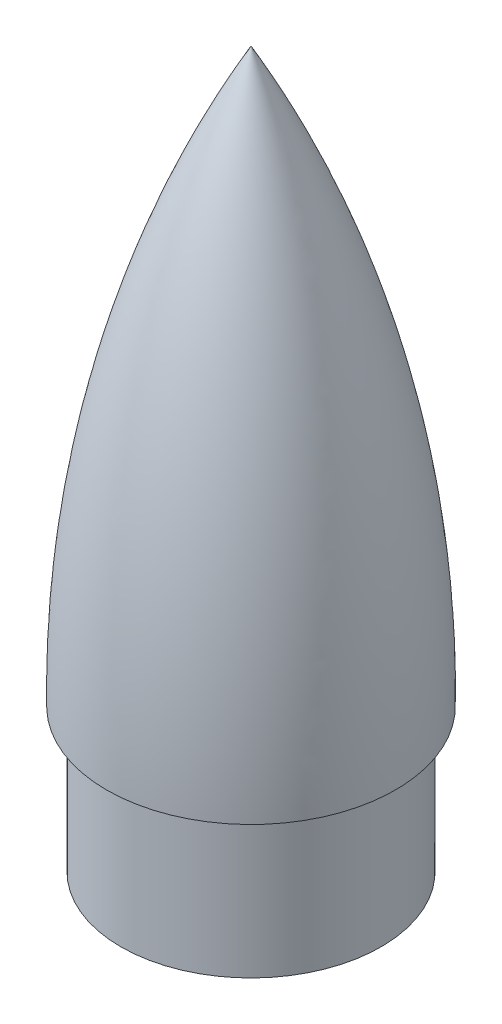
ISO-10303-21;
HEADER;
FILE_DESCRIPTION(('STEP AP214'),'2;1');
FILE_NAME('part.step','',(''),(''),'','','');
FILE_SCHEMA(('AUTOMOTIVE_DESIGN { 1 0 10303 214 1 1 1 1 }'));
ENDSEC;
DATA;
#1=APPLICATION_CONTEXT('core data for automotive mechanical design processes');
#2=APPLICATION_PROTOCOL_DEFINITION('international standard','automotive_design',2000,#1);
#3=PRODUCT_CONTEXT('',#1,'mechanical');
#4=PRODUCT('Part','Part','',(#3));
#5=PRODUCT_RELATED_PRODUCT_CATEGORY('part','',(#4));
#6=PRODUCT_DEFINITION_FORMATION('','',#4);
#7=PRODUCT_DEFINITION_CONTEXT('part definition',#1,'design');
#8=PRODUCT_DEFINITION('design','',#6,#7);
#9=PRODUCT_DEFINITION_SHAPE('','',#8);
#10=(LENGTH_UNIT() NAMED_UNIT(*) SI_UNIT(.MILLI.,.METRE.));
#11=(NAMED_UNIT(*) PLANE_ANGLE_UNIT() SI_UNIT($,.RADIAN.));
#12=(NAMED_UNIT(*) SI_UNIT($,.STERADIAN.) SOLID_ANGLE_UNIT());
#13=UNCERTAINTY_MEASURE_WITH_UNIT(LENGTH_MEASURE(1.E-05),#10,'distance_accuracy_value','');
#14=(GEOMETRIC_REPRESENTATION_CONTEXT(3) GLOBAL_UNCERTAINTY_ASSIGNED_CONTEXT((#13)) GLOBAL_UNIT_ASSIGNED_CONTEXT((#10,
#11,#12)) REPRESENTATION_CONTEXT('',''));
#15=CARTESIAN_POINT('',(0.,0.,0.));
#16=DIRECTION('',(0.,0.,1.));
#17=DIRECTION('',(1.,0.,0.));
#18=AXIS2_PLACEMENT_3D('',#15,#16,#17);
#19=CARTESIAN_POINT('',(0.,22.1539108888663,-139.785501430232));
#20=DIRECTION('',(-1.,0.,0.));
#21=DIRECTION('',(0.,0.,1.));
#22=AXIS2_PLACEMENT_3D('',#19,#20,#21);
#23=CIRCLE('',#22,160.);
#24=TRIMMED_CURVE('',#23,(PARAMETER_VALUE(-0.508122783091754)),
(PARAMETER_VALUE(0.508122783091754)),.T.,.PARAMETER.);
#25=CARTESIAN_POINT('',(0.,22.1539108888663,0.));
#26=DIRECTION('',(0.,1.,0.));
#27=AXIS1_PLACEMENT('',#25,#26);
#28=SURFACE_OF_REVOLUTION('',#24,#27);
#29=CARTESIAN_POINT('',(0.,20.,0.));
#30=DIRECTION('',(0.,1.,0.));
#31=DIRECTION('',(0.,0.,1.));
#32=AXIS2_PLACEMENT_3D('',#29,#30,#31);
#33=CIRCLE('',#32,20.2);
#34=CARTESIAN_POINT('',(0.,20.,20.2));
#35=VERTEX_POINT('',#34);
#36=EDGE_CURVE('E55',#35,#35,#33,.T.);
#37=ORIENTED_EDGE('',*,*,#36,.T.);
#38=EDGE_LOOP('',(#37));
#39=FACE_BOUND('',#38,.T.);
#40=CARTESIAN_POINT('',(0.,100.,0.));
#41=VERTEX_POINT('',#40);
#42=VERTEX_LOOP('',#41);
#43=FACE_BOUND('',#42,.T.);
#44=ADVANCED_FACE('F36',(#39,#43),#28,.T.);
#45=CARTESIAN_POINT('',(0.,0.,0.));
#46=DIRECTION('',(0.,-1.,0.));
#47=DIRECTION('',(0.,0.,-1.));
#48=AXIS2_PLACEMENT_3D('',#45,#46,#47);
#49=PLANE('',#48);
#50=CARTESIAN_POINT('',(0.,0.,0.));
#51=DIRECTION('',(0.,1.,0.));
#52=DIRECTION('',(0.,0.,1.));
#53=AXIS2_PLACEMENT_3D('',#50,#51,#52);
#54=CIRCLE('',#53,18.2);
#55=CARTESIAN_POINT('',(0.,0.,18.2));
#56=VERTEX_POINT('',#55);
#57=EDGE_CURVE('E11',#56,#56,#54,.T.);
#58=ORIENTED_EDGE('',*,*,#57,.F.);
#59=EDGE_LOOP('',(#58));
#60=FACE_BOUND('',#59,.T.);
#61=ADVANCED_FACE('F46',(#60),#49,.T.);
#62=CARTESIAN_POINT('',(0.,40.2645190678488,0.));
#63=DIRECTION('',(0.,1.,0.));
#64=DIRECTION('',(0.,0.,1.));
#65=AXIS2_PLACEMENT_3D('',#62,#63,#64);
#66=CYLINDRICAL_SURFACE('',#65,18.2);
#67=ORIENTED_EDGE('',*,*,#57,.T.);
#68=EDGE_LOOP('',(#67));
#69=FACE_BOUND('',#68,.T.);
#70=CARTESIAN_POINT('',(0.,20.,0.));
#71=DIRECTION('',(0.,1.,0.));
#72=DIRECTION('',(0.,0.,1.));
#73=AXIS2_PLACEMENT_3D('',#70,#71,#72);
#74=CIRCLE('',#73,18.2);
#75=CARTESIAN_POINT('',(0.,20.,18.2));
#76=VERTEX_POINT('',#75);
#77=EDGE_CURVE('E42',#76,#76,#74,.T.);
#78=ORIENTED_EDGE('',*,*,#77,.F.);
#79=EDGE_LOOP('',(#78));
#80=FACE_BOUND('',#79,.T.);
#81=ADVANCED_FACE('F51',(#69,#80),#66,.T.);
#82=CARTESIAN_POINT('',(-18.2,20.,0.));
#83=DIRECTION('',(0.,-1.,0.));
#84=DIRECTION('',(0.,0.,-1.));
#85=AXIS2_PLACEMENT_3D('',#82,#83,#84);
#86=PLANE('',#85);
#87=ORIENTED_EDGE('',*,*,#77,.T.);
#88=EDGE_LOOP('',(#87));
#89=FACE_BOUND('',#88,.T.);
#90=ORIENTED_EDGE('',*,*,#36,.F.);
#91=EDGE_LOOP('',(#90));
#92=FACE_BOUND('',#91,.T.);
#93=ADVANCED_FACE('F61',(#89,#92),#86,.T.);
#94=CLOSED_SHELL('',(#44,#61,#81,#93));
#95=MANIFOLD_SOLID_BREP('B2',#94);
#96=ADVANCED_BREP_SHAPE_REPRESENTATION('',(#18,#95),#14);
#97=SHAPE_DEFINITION_REPRESENTATION(#9,#96);
ENDSEC;
END-ISO-10303-21;
